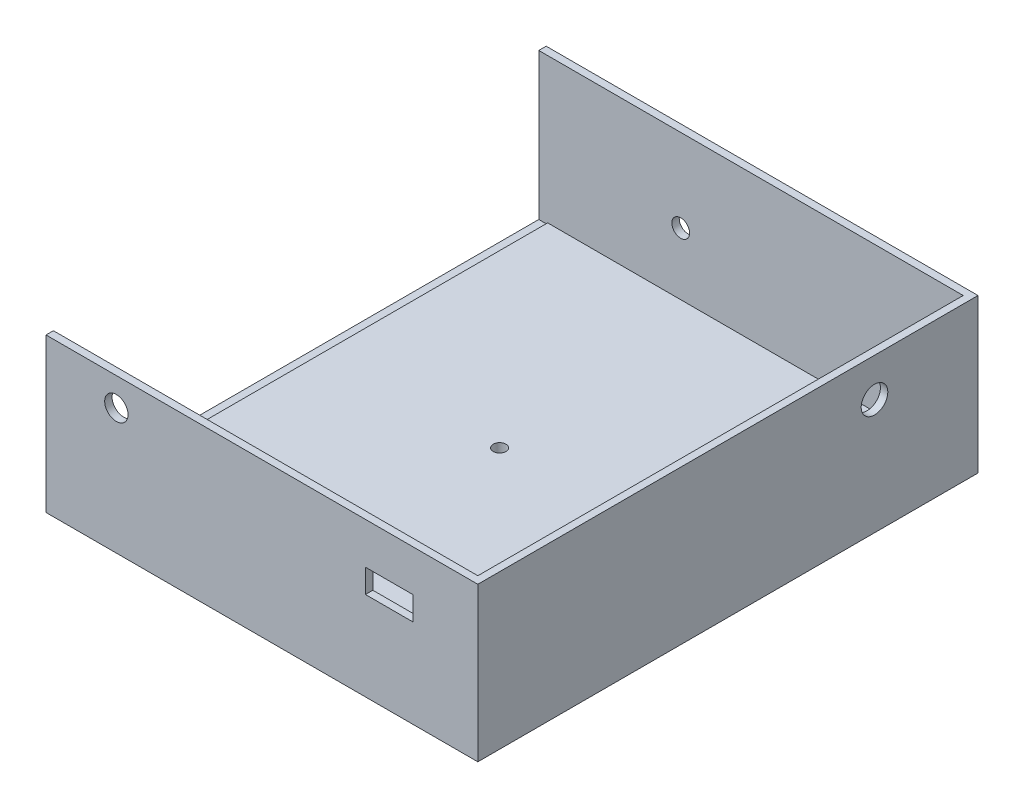
ISO-10303-21;
HEADER;
FILE_DESCRIPTION(('STEP AP214'),'2;1');
FILE_NAME('part.step','',(''),(''),'','','');
FILE_SCHEMA(('AUTOMOTIVE_DESIGN { 1 0 10303 214 1 1 1 1 }'));
ENDSEC;
DATA;
#1=APPLICATION_CONTEXT('core data for automotive mechanical design processes');
#2=APPLICATION_PROTOCOL_DEFINITION('international standard','automotive_design',2000,#1);
#3=PRODUCT_CONTEXT('',#1,'mechanical');
#4=PRODUCT('Part','Part','',(#3));
#5=PRODUCT_RELATED_PRODUCT_CATEGORY('part','',(#4));
#6=PRODUCT_DEFINITION_FORMATION('','',#4);
#7=PRODUCT_DEFINITION_CONTEXT('part definition',#1,'design');
#8=PRODUCT_DEFINITION('design','',#6,#7);
#9=PRODUCT_DEFINITION_SHAPE('','',#8);
#10=(LENGTH_UNIT() NAMED_UNIT(*) SI_UNIT(.MILLI.,.METRE.));
#11=(NAMED_UNIT(*) PLANE_ANGLE_UNIT() SI_UNIT($,.RADIAN.));
#12=(NAMED_UNIT(*) SI_UNIT($,.STERADIAN.) SOLID_ANGLE_UNIT());
#13=UNCERTAINTY_MEASURE_WITH_UNIT(LENGTH_MEASURE(1.E-05),#10,'distance_accuracy_value','');
#14=(GEOMETRIC_REPRESENTATION_CONTEXT(3) GLOBAL_UNCERTAINTY_ASSIGNED_CONTEXT((#13)) GLOBAL_UNIT_ASSIGNED_CONTEXT((#10,
#11,#12)) REPRESENTATION_CONTEXT('',''));
#15=CARTESIAN_POINT('',(0.,0.,0.));
#16=DIRECTION('',(0.,0.,1.));
#17=DIRECTION('',(1.,0.,0.));
#18=AXIS2_PLACEMENT_3D('',#15,#16,#17);
#19=CARTESIAN_POINT('',(0.,3.,0.));
#20=DIRECTION('',(0.,-1.,0.));
#21=DIRECTION('',(0.,0.,-1.));
#22=AXIS2_PLACEMENT_3D('',#19,#20,#21);
#23=PLANE('',#22);
#24=CARTESIAN_POINT('',(-29.370088028169,3.,-19.5179313380281));
#25=DIRECTION('',(0.,1.,0.));
#26=DIRECTION('',(0.,0.,1.));
#27=AXIS2_PLACEMENT_3D('',#24,#25,#26);
#28=CIRCLE('',#27,2.16);
#29=CARTESIAN_POINT('',(-29.370088028169,3.,-17.3579313380281));
#30=VERTEX_POINT('',#29);
#31=EDGE_CURVE('E198',#30,#30,#28,.T.);
#32=ORIENTED_EDGE('',*,*,#31,.F.);
#33=EDGE_LOOP('',(#32));
#34=FACE_BOUND('',#33,.T.);
#35=CARTESIAN_POINT('',(39.2399119718309,3.,-79.3579313380281));
#36=DIRECTION('',(0.,1.,0.));
#37=DIRECTION('',(0.,0.,1.));
#38=AXIS2_PLACEMENT_3D('',#35,#36,#37);
#39=CIRCLE('',#38,2.16);
#40=CARTESIAN_POINT('',(39.2399119718309,3.,-77.1979313380281));
#41=VERTEX_POINT('',#40);
#42=EDGE_CURVE('E205',#41,#41,#39,.T.);
#43=ORIENTED_EDGE('',*,*,#42,.F.);
#44=EDGE_LOOP('',(#43));
#45=FACE_BOUND('',#44,.T.);
#46=CARTESIAN_POINT('',(39.2399119718309,3.,56.4620686619718));
#47=DIRECTION('',(0.,1.,0.));
#48=DIRECTION('',(0.,0.,1.));
#49=AXIS2_PLACEMENT_3D('',#46,#47,#48);
#50=CIRCLE('',#49,2.16);
#51=CARTESIAN_POINT('',(39.2399119718309,3.,58.6220686619718));
#52=VERTEX_POINT('',#51);
#53=EDGE_CURVE('E201',#52,#52,#50,.T.);
#54=ORIENTED_EDGE('',*,*,#53,.F.);
#55=EDGE_LOOP('',(#54));
#56=FACE_BOUND('',#55,.T.);
#57=DIRECTION('',(0.,0.,-1.));
#58=VECTOR('',#57,1.);
#59=CARTESIAN_POINT('',(-87.130088028169,3.,0.));
#60=LINE('',#59,#58);
#61=CARTESIAN_POINT('',(-87.130088028169,3.,70.6220686619718));
#62=VERTEX_POINT('',#61);
#63=CARTESIAN_POINT('',(-87.130088028169,3.,-93.5179313380281));
#64=VERTEX_POINT('',#63);
#65=EDGE_CURVE('E11',#62,#64,#60,.T.);
#66=ORIENTED_EDGE('',*,*,#65,.F.);
#67=DIRECTION('',(1.,0.,0.));
#68=VECTOR('',#67,1.);
#69=CARTESIAN_POINT('',(-87.630088028169,3.,70.6220686619718));
#70=LINE('',#69,#68);
#71=CARTESIAN_POINT('',(53.399911971831,3.,70.6220686619718));
#72=VERTEX_POINT('',#71);
#73=EDGE_CURVE('E225',#62,#72,#70,.T.);
#74=ORIENTED_EDGE('',*,*,#73,.T.);
#75=DIRECTION('',(0.,0.,1.));
#76=VECTOR('',#75,1.);
#77=CARTESIAN_POINT('',(53.3999119718309,3.,-93.5179313380281));
#78=LINE('',#77,#76);
#79=CARTESIAN_POINT('',(53.3999119718309,3.,-93.5179313380281));
#80=VERTEX_POINT('',#79);
#81=EDGE_CURVE('E221',#80,#72,#78,.T.);
#82=ORIENTED_EDGE('',*,*,#81,.F.);
#83=DIRECTION('',(1.,0.,0.));
#84=VECTOR('',#83,1.);
#85=CARTESIAN_POINT('',(-87.630088028169,3.,-93.5179313380281));
#86=LINE('',#85,#84);
#87=EDGE_CURVE('E219',#64,#80,#86,.T.);
#88=ORIENTED_EDGE('',*,*,#87,.F.);
#89=EDGE_LOOP('',(#66,#74,#82,#88));
#90=FACE_BOUND('',#89,.T.);
#91=ADVANCED_FACE('F43',(#34,#45,#56,#90),#23,.F.);
#92=CARTESIAN_POINT('',(0.,52.,0.));
#93=DIRECTION('',(0.,-1.,0.));
#94=DIRECTION('',(0.,0.,-1.));
#95=AXIS2_PLACEMENT_3D('',#92,#93,#94);
#96=PLANE('',#95);
#97=DIRECTION('',(0.,0.,1.));
#98=VECTOR('',#97,1.);
#99=CARTESIAN_POINT('',(-90.130088028169,52.,-96.0179313380281));
#100=LINE('',#99,#98);
#101=CARTESIAN_POINT('',(-90.130088028169,52.,-96.0179313380281));
#102=VERTEX_POINT('',#101);
#103=CARTESIAN_POINT('',(-90.130088028169,52.,-93.5179313380281));
#104=VERTEX_POINT('',#103);
#105=EDGE_CURVE('E249',#102,#104,#100,.T.);
#106=ORIENTED_EDGE('',*,*,#105,.T.);
#107=DIRECTION('',(1.,0.,0.));
#108=VECTOR('',#107,1.);
#109=CARTESIAN_POINT('',(-87.630088028169,52.,-93.5179313380281));
#110=LINE('',#109,#108);
#111=CARTESIAN_POINT('',(53.3999119718309,52.,-93.5179313380281));
#112=VERTEX_POINT('',#111);
#113=EDGE_CURVE('E218',#104,#112,#110,.T.);
#114=ORIENTED_EDGE('',*,*,#113,.T.);
#115=DIRECTION('',(0.,0.,1.));
#116=VECTOR('',#115,1.);
#117=CARTESIAN_POINT('',(53.3999119718309,52.,-93.5179313380281));
#118=LINE('',#117,#116);
#119=CARTESIAN_POINT('',(53.399911971831,52.,70.6220686619718));
#120=VERTEX_POINT('',#119);
#121=EDGE_CURVE('E229',#112,#120,#118,.T.);
#122=ORIENTED_EDGE('',*,*,#121,.T.);
#123=DIRECTION('',(1.,0.,0.));
#124=VECTOR('',#123,1.);
#125=CARTESIAN_POINT('',(-87.630088028169,52.,70.6220686619718));
#126=LINE('',#125,#124);
#127=CARTESIAN_POINT('',(-90.130088028169,52.,70.6220686619718));
#128=VERTEX_POINT('',#127);
#129=EDGE_CURVE('E222',#128,#120,#126,.T.);
#130=ORIENTED_EDGE('',*,*,#129,.F.);
#131=CARTESIAN_POINT('',(-90.130088028169,52.,73.1220686619718));
#132=VERTEX_POINT('',#131);
#133=EDGE_CURVE('E248',#128,#132,#100,.T.);
#134=ORIENTED_EDGE('',*,*,#133,.T.);
#135=DIRECTION('',(1.,0.,0.));
#136=VECTOR('',#135,1.);
#137=CARTESIAN_POINT('',(-90.130088028169,52.,73.1220686619718));
#138=LINE('',#137,#136);
#139=CARTESIAN_POINT('',(55.899911971831,52.,73.1220686619718));
#140=VERTEX_POINT('',#139);
#141=EDGE_CURVE('E246',#132,#140,#138,.T.);
#142=ORIENTED_EDGE('',*,*,#141,.T.);
#143=DIRECTION('',(0.,0.,1.));
#144=VECTOR('',#143,1.);
#145=CARTESIAN_POINT('',(55.8999119718309,52.,-96.0179313380281));
#146=LINE('',#145,#144);
#147=CARTESIAN_POINT('',(55.8999119718309,52.,-96.0179313380281));
#148=VERTEX_POINT('',#147);
#149=EDGE_CURVE('E242',#148,#140,#146,.T.);
#150=ORIENTED_EDGE('',*,*,#149,.F.);
#151=DIRECTION('',(1.,0.,0.));
#152=VECTOR('',#151,1.);
#153=CARTESIAN_POINT('',(-90.130088028169,52.,-96.0179313380281));
#154=LINE('',#153,#152);
#155=EDGE_CURVE('E239',#102,#148,#154,.T.);
#156=ORIENTED_EDGE('',*,*,#155,.F.);
#157=EDGE_LOOP('',(#106,#114,#122,#130,#134,#142,#150,#156));
#158=FACE_BOUND('',#157,.T.);
#159=ADVANCED_FACE('F297',(#158),#96,.F.);
#160=CARTESIAN_POINT('',(-90.130088028169,52.,-96.0179313380281));
#161=DIRECTION('',(0.,0.,-1.));
#162=DIRECTION('',(-1.,0.,0.));
#163=AXIS2_PLACEMENT_3D('',#160,#161,#162);
#164=PLANE('',#163);
#165=CARTESIAN_POINT('',(-42.130088028169,24.,-96.0179313380281));
#166=DIRECTION('',(0.,0.,-1.));
#167=DIRECTION('',(-1.,0.,0.));
#168=AXIS2_PLACEMENT_3D('',#165,#166,#167);
#169=CIRCLE('',#168,3.);
#170=CARTESIAN_POINT('',(-45.130088028169,24.,-96.0179313380281));
#171=VERTEX_POINT('',#170);
#172=EDGE_CURVE('E287',#171,#171,#169,.T.);
#173=ORIENTED_EDGE('',*,*,#172,.F.);
#174=EDGE_LOOP('',(#173));
#175=FACE_BOUND('',#174,.T.);
#176=DIRECTION('',(1.,0.,0.));
#177=VECTOR('',#176,1.);
#178=CARTESIAN_POINT('',(-90.130088028169,0.,-96.0179313380281));
#179=LINE('',#178,#177);
#180=CARTESIAN_POINT('',(-90.130088028169,0.,-96.0179313380281));
#181=VERTEX_POINT('',#180);
#182=CARTESIAN_POINT('',(55.8999119718309,0.,-96.0179313380281));
#183=VERTEX_POINT('',#182);
#184=EDGE_CURVE('E238',#181,#183,#179,.T.);
#185=ORIENTED_EDGE('',*,*,#184,.F.);
#186=DIRECTION('',(0.,-1.,0.));
#187=VECTOR('',#186,1.);
#188=CARTESIAN_POINT('',(-90.130088028169,52.,-96.0179313380281));
#189=LINE('',#188,#187);
#190=EDGE_CURVE('E262',#102,#181,#189,.T.);
#191=ORIENTED_EDGE('',*,*,#190,.F.);
#192=ORIENTED_EDGE('',*,*,#155,.T.);
#193=DIRECTION('',(0.,-1.,0.));
#194=VECTOR('',#193,1.);
#195=CARTESIAN_POINT('',(55.8999119718309,52.,-96.0179313380281));
#196=LINE('',#195,#194);
#197=EDGE_CURVE('E252',#148,#183,#196,.T.);
#198=ORIENTED_EDGE('',*,*,#197,.T.);
#199=EDGE_LOOP('',(#185,#191,#192,#198));
#200=FACE_BOUND('',#199,.T.);
#201=ADVANCED_FACE('F45',(#175,#200),#164,.T.);
#202=CARTESIAN_POINT('',(-90.130088028169,52.,-96.0179313380281));
#203=DIRECTION('',(1.,0.,0.));
#204=DIRECTION('',(0.,0.,-1.));
#205=AXIS2_PLACEMENT_3D('',#202,#203,#204);
#206=PLANE('',#205);
#207=DIRECTION('',(0.,0.,1.));
#208=VECTOR('',#207,1.);
#209=CARTESIAN_POINT('',(-90.130088028169,2.5,-93.5179313380281));
#210=LINE('',#209,#208);
#211=CARTESIAN_POINT('',(-90.130088028169,2.5,-93.5179313380281));
#212=VERTEX_POINT('',#211);
#213=CARTESIAN_POINT('',(-90.130088028169,2.5,70.6220686619718));
#214=VERTEX_POINT('',#213);
#215=EDGE_CURVE('E170',#212,#214,#210,.T.);
#216=ORIENTED_EDGE('',*,*,#215,.F.);
#217=DIRECTION('',(0.,-1.,0.));
#218=VECTOR('',#217,1.);
#219=CARTESIAN_POINT('',(-90.130088028169,52.,-93.5179313380281));
#220=LINE('',#219,#218);
#221=EDGE_CURVE('E158',#104,#212,#220,.T.);
#222=ORIENTED_EDGE('',*,*,#221,.F.);
#223=ORIENTED_EDGE('',*,*,#105,.F.);
#224=ORIENTED_EDGE('',*,*,#190,.T.);
#225=DIRECTION('',(0.,0.,1.));
#226=VECTOR('',#225,1.);
#227=CARTESIAN_POINT('',(-90.130088028169,0.,-96.0179313380281));
#228=LINE('',#227,#226);
#229=CARTESIAN_POINT('',(-90.130088028169,0.,73.1220686619718));
#230=VERTEX_POINT('',#229);
#231=EDGE_CURVE('E243',#181,#230,#228,.T.);
#232=ORIENTED_EDGE('',*,*,#231,.T.);
#233=DIRECTION('',(0.,-1.,0.));
#234=VECTOR('',#233,1.);
#235=CARTESIAN_POINT('',(-90.130088028169,52.,73.1220686619718));
#236=LINE('',#235,#234);
#237=EDGE_CURVE('E265',#132,#230,#236,.T.);
#238=ORIENTED_EDGE('',*,*,#237,.F.);
#239=ORIENTED_EDGE('',*,*,#133,.F.);
#240=DIRECTION('',(0.,1.,0.));
#241=VECTOR('',#240,1.);
#242=CARTESIAN_POINT('',(-90.130088028169,52.,70.6220686619718));
#243=LINE('',#242,#241);
#244=EDGE_CURVE('E152',#214,#128,#243,.T.);
#245=ORIENTED_EDGE('',*,*,#244,.F.);
#246=EDGE_LOOP('',(#216,#222,#223,#224,#232,#238,#239,#245));
#247=FACE_BOUND('',#246,.T.);
#248=ADVANCED_FACE('F296',(#247),#206,.F.);
#249=CARTESIAN_POINT('',(-90.130088028169,52.,73.1220686619718));
#250=DIRECTION('',(0.,0.,-1.));
#251=DIRECTION('',(-1.,0.,0.));
#252=AXIS2_PLACEMENT_3D('',#249,#250,#251);
#253=PLANE('',#252);
#254=CARTESIAN_POINT('',(-66.3389109501777,42.5,73.1220686619718));
#255=DIRECTION('',(0.,0.,1.));
#256=DIRECTION('',(1.,0.,0.));
#257=AXIS2_PLACEMENT_3D('',#254,#255,#256);
#258=CIRCLE('',#257,3.95000000000001);
#259=CARTESIAN_POINT('',(-62.3889109501777,42.5,73.1220686619718));
#260=VERTEX_POINT('',#259);
#261=EDGE_CURVE('E280',#260,#260,#258,.T.);
#262=ORIENTED_EDGE('',*,*,#261,.F.);
#263=EDGE_LOOP('',(#262));
#264=FACE_BOUND('',#263,.T.);
#265=DIRECTION('',(0.,-1.,0.));
#266=VECTOR('',#265,1.);
#267=CARTESIAN_POINT('',(33.899911971831,38.,73.1220686619718));
#268=LINE('',#267,#266);
#269=CARTESIAN_POINT('',(33.899911971831,38.,73.1220686619718));
#270=VERTEX_POINT('',#269);
#271=CARTESIAN_POINT('',(33.899911971831,30.,73.1220686619718));
#272=VERTEX_POINT('',#271);
#273=EDGE_CURVE('E177',#270,#272,#268,.T.);
#274=ORIENTED_EDGE('',*,*,#273,.T.);
#275=DIRECTION('',(1.,0.,0.));
#276=VECTOR('',#275,1.);
#277=CARTESIAN_POINT('',(17.899911971831,30.,73.1220686619718));
#278=LINE('',#277,#276);
#279=CARTESIAN_POINT('',(17.899911971831,30.,73.1220686619718));
#280=VERTEX_POINT('',#279);
#281=EDGE_CURVE('E67',#280,#272,#278,.T.);
#282=ORIENTED_EDGE('',*,*,#281,.F.);
#283=DIRECTION('',(0.,-1.,0.));
#284=VECTOR('',#283,1.);
#285=CARTESIAN_POINT('',(17.899911971831,38.,73.1220686619718));
#286=LINE('',#285,#284);
#287=CARTESIAN_POINT('',(17.899911971831,38.,73.1220686619718));
#288=VERTEX_POINT('',#287);
#289=EDGE_CURVE('E183',#288,#280,#286,.T.);
#290=ORIENTED_EDGE('',*,*,#289,.F.);
#291=DIRECTION('',(1.,0.,0.));
#292=VECTOR('',#291,1.);
#293=CARTESIAN_POINT('',(17.899911971831,38.,73.1220686619718));
#294=LINE('',#293,#292);
#295=EDGE_CURVE('E180',#288,#270,#294,.T.);
#296=ORIENTED_EDGE('',*,*,#295,.T.);
#297=EDGE_LOOP('',(#274,#282,#290,#296));
#298=FACE_BOUND('',#297,.T.);
#299=DIRECTION('',(1.,0.,0.));
#300=VECTOR('',#299,1.);
#301=CARTESIAN_POINT('',(-90.130088028169,0.,73.1220686619718));
#302=LINE('',#301,#300);
#303=CARTESIAN_POINT('',(55.899911971831,0.,73.1220686619718));
#304=VERTEX_POINT('',#303);
#305=EDGE_CURVE('E258',#230,#304,#302,.T.);
#306=ORIENTED_EDGE('',*,*,#305,.T.);
#307=DIRECTION('',(0.,-1.,0.));
#308=VECTOR('',#307,1.);
#309=CARTESIAN_POINT('',(55.899911971831,52.,73.1220686619718));
#310=LINE('',#309,#308);
#311=EDGE_CURVE('E268',#140,#304,#310,.T.);
#312=ORIENTED_EDGE('',*,*,#311,.F.);
#313=ORIENTED_EDGE('',*,*,#141,.F.);
#314=ORIENTED_EDGE('',*,*,#237,.T.);
#315=EDGE_LOOP('',(#306,#312,#313,#314));
#316=FACE_BOUND('',#315,.T.);
#317=ADVANCED_FACE('F310',(#264,#298,#316),#253,.F.);
#318=CARTESIAN_POINT('',(55.8999119718309,52.,-96.0179313380281));
#319=DIRECTION('',(1.,0.,0.));
#320=DIRECTION('',(0.,0.,-1.));
#321=AXIS2_PLACEMENT_3D('',#318,#319,#320);
#322=PLANE('',#321);
#323=CARTESIAN_POINT('',(55.899911971831,39.,-61.0179313380281));
#324=DIRECTION('',(1.,0.,0.));
#325=DIRECTION('',(0.,0.,-1.));
#326=AXIS2_PLACEMENT_3D('',#323,#324,#325);
#327=CIRCLE('',#326,4.50000000000001);
#328=CARTESIAN_POINT('',(55.899911971831,39.,-65.5179313380281));
#329=VERTEX_POINT('',#328);
#330=EDGE_CURVE('E189',#329,#329,#327,.T.);
#331=ORIENTED_EDGE('',*,*,#330,.F.);
#332=EDGE_LOOP('',(#331));
#333=FACE_BOUND('',#332,.T.);
#334=DIRECTION('',(0.,0.,1.));
#335=VECTOR('',#334,1.);
#336=CARTESIAN_POINT('',(55.8999119718309,0.,-96.0179313380281));
#337=LINE('',#336,#335);
#338=EDGE_CURVE('E255',#183,#304,#337,.T.);
#339=ORIENTED_EDGE('',*,*,#338,.F.);
#340=ORIENTED_EDGE('',*,*,#197,.F.);
#341=ORIENTED_EDGE('',*,*,#149,.T.);
#342=ORIENTED_EDGE('',*,*,#311,.T.);
#343=EDGE_LOOP('',(#339,#340,#341,#342));
#344=FACE_BOUND('',#343,.T.);
#345=ADVANCED_FACE('F421',(#333,#344),#322,.T.);
#346=CARTESIAN_POINT('',(0.,0.,0.));
#347=DIRECTION('',(0.,-1.,0.));
#348=DIRECTION('',(0.,0.,-1.));
#349=AXIS2_PLACEMENT_3D('',#346,#347,#348);
#350=PLANE('',#349);
#351=CARTESIAN_POINT('',(39.2399119718309,0.,56.4620686619718));
#352=DIRECTION('',(0.,-1.,0.));
#353=DIRECTION('',(0.,0.,-1.));
#354=AXIS2_PLACEMENT_3D('',#351,#352,#353);
#355=CIRCLE('',#354,2.16);
#356=CARTESIAN_POINT('',(39.2399119718309,0.,54.3020686619718));
#357=VERTEX_POINT('',#356);
#358=EDGE_CURVE('E215',#357,#357,#355,.T.);
#359=ORIENTED_EDGE('',*,*,#358,.F.);
#360=EDGE_LOOP('',(#359));
#361=FACE_BOUND('',#360,.T.);
#362=CARTESIAN_POINT('',(39.2399119718309,0.,-79.3579313380281));
#363=DIRECTION('',(0.,-1.,0.));
#364=DIRECTION('',(0.,0.,-1.));
#365=AXIS2_PLACEMENT_3D('',#362,#363,#364);
#366=CIRCLE('',#365,2.16);
#367=CARTESIAN_POINT('',(39.2399119718309,0.,-81.5179313380281));
#368=VERTEX_POINT('',#367);
#369=EDGE_CURVE('E212',#368,#368,#366,.T.);
#370=ORIENTED_EDGE('',*,*,#369,.F.);
#371=EDGE_LOOP('',(#370));
#372=FACE_BOUND('',#371,.T.);
#373=CARTESIAN_POINT('',(-29.370088028169,0.,-19.5179313380281));
#374=DIRECTION('',(0.,-1.,0.));
#375=DIRECTION('',(0.,0.,-1.));
#376=AXIS2_PLACEMENT_3D('',#373,#374,#375);
#377=CIRCLE('',#376,2.16);
#378=CARTESIAN_POINT('',(-29.370088028169,0.,-21.6779313380282));
#379=VERTEX_POINT('',#378);
#380=EDGE_CURVE('E204',#379,#379,#377,.T.);
#381=ORIENTED_EDGE('',*,*,#380,.F.);
#382=EDGE_LOOP('',(#381));
#383=FACE_BOUND('',#382,.T.);
#384=ORIENTED_EDGE('',*,*,#184,.T.);
#385=ORIENTED_EDGE('',*,*,#338,.T.);
#386=ORIENTED_EDGE('',*,*,#305,.F.);
#387=ORIENTED_EDGE('',*,*,#231,.F.);
#388=EDGE_LOOP('',(#384,#385,#386,#387));
#389=FACE_BOUND('',#388,.T.);
#390=ADVANCED_FACE('F303',(#361,#372,#383,#389),#350,.T.);
#391=CARTESIAN_POINT('',(-87.630088028169,3.,-93.5179313380281));
#392=DIRECTION('',(0.,0.,1.));
#393=DIRECTION('',(1.,0.,0.));
#394=AXIS2_PLACEMENT_3D('',#391,#392,#393);
#395=PLANE('',#394);
#396=CARTESIAN_POINT('',(-42.130088028169,24.,-93.5179313380281));
#397=DIRECTION('',(0.,0.,1.));
#398=DIRECTION('',(1.,0.,0.));
#399=AXIS2_PLACEMENT_3D('',#396,#397,#398);
#400=CIRCLE('',#399,3.);
#401=CARTESIAN_POINT('',(-39.130088028169,24.,-93.5179313380281));
#402=VERTEX_POINT('',#401);
#403=EDGE_CURVE('E47',#402,#402,#400,.T.);
#404=ORIENTED_EDGE('',*,*,#403,.F.);
#405=EDGE_LOOP('',(#404));
#406=FACE_BOUND('',#405,.T.);
#407=ORIENTED_EDGE('',*,*,#113,.F.);
#408=ORIENTED_EDGE('',*,*,#221,.T.);
#409=DIRECTION('',(-1.,0.,0.));
#410=VECTOR('',#409,1.);
#411=CARTESIAN_POINT('',(-87.130088028169,2.5,-93.5179313380281));
#412=LINE('',#411,#410);
#413=CARTESIAN_POINT('',(-87.130088028169,2.5,-93.5179313380281));
#414=VERTEX_POINT('',#413);
#415=EDGE_CURVE('E155',#414,#212,#412,.T.);
#416=ORIENTED_EDGE('',*,*,#415,.F.);
#417=DIRECTION('',(0.,-1.,0.));
#418=VECTOR('',#417,1.);
#419=CARTESIAN_POINT('',(-87.130088028169,52.,-93.5179313380281));
#420=LINE('',#419,#418);
#421=EDGE_CURVE('E145',#64,#414,#420,.T.);
#422=ORIENTED_EDGE('',*,*,#421,.F.);
#423=ORIENTED_EDGE('',*,*,#87,.T.);
#424=DIRECTION('',(0.,1.,0.));
#425=VECTOR('',#424,1.);
#426=CARTESIAN_POINT('',(53.3999119718309,3.,-93.5179313380281));
#427=LINE('',#426,#425);
#428=EDGE_CURVE('E235',#80,#112,#427,.T.);
#429=ORIENTED_EDGE('',*,*,#428,.T.);
#430=EDGE_LOOP('',(#407,#408,#416,#422,#423,#429));
#431=FACE_BOUND('',#430,.T.);
#432=ADVANCED_FACE('F156',(#406,#431),#395,.T.);
#433=CARTESIAN_POINT('',(53.3999119718309,3.,-93.5179313380281));
#434=DIRECTION('',(-1.,0.,0.));
#435=DIRECTION('',(0.,0.,1.));
#436=AXIS2_PLACEMENT_3D('',#433,#434,#435);
#437=PLANE('',#436);
#438=CARTESIAN_POINT('',(53.399911971831,39.,-61.0179313380281));
#439=DIRECTION('',(1.,0.,0.));
#440=DIRECTION('',(0.,0.,-1.));
#441=AXIS2_PLACEMENT_3D('',#438,#439,#440);
#442=CIRCLE('',#441,4.50000000000001);
#443=CARTESIAN_POINT('',(53.399911971831,39.,-65.5179313380281));
#444=VERTEX_POINT('',#443);
#445=EDGE_CURVE('E195',#444,#444,#442,.T.);
#446=ORIENTED_EDGE('',*,*,#445,.T.);
#447=EDGE_LOOP('',(#446));
#448=FACE_BOUND('',#447,.T.);
#449=ORIENTED_EDGE('',*,*,#121,.F.);
#450=ORIENTED_EDGE('',*,*,#428,.F.);
#451=ORIENTED_EDGE('',*,*,#81,.T.);
#452=DIRECTION('',(0.,1.,0.));
#453=VECTOR('',#452,1.);
#454=CARTESIAN_POINT('',(53.399911971831,3.,70.6220686619718));
#455=LINE('',#454,#453);
#456=EDGE_CURVE('E227',#72,#120,#455,.T.);
#457=ORIENTED_EDGE('',*,*,#456,.T.);
#458=EDGE_LOOP('',(#449,#450,#451,#457));
#459=FACE_BOUND('',#458,.T.);
#460=ADVANCED_FACE('F326',(#448,#459),#437,.T.);
#461=CARTESIAN_POINT('',(-87.630088028169,3.,70.6220686619718));
#462=DIRECTION('',(0.,0.,1.));
#463=DIRECTION('',(1.,0.,0.));
#464=AXIS2_PLACEMENT_3D('',#461,#462,#463);
#465=PLANE('',#464);
#466=CARTESIAN_POINT('',(-66.3389109501777,42.5,70.6220686619718));
#467=DIRECTION('',(0.,0.,1.));
#468=DIRECTION('',(1.,0.,0.));
#469=AXIS2_PLACEMENT_3D('',#466,#467,#468);
#470=CIRCLE('',#469,3.95000000000001);
#471=CARTESIAN_POINT('',(-62.3889109501777,42.5,70.6220686619718));
#472=VERTEX_POINT('',#471);
#473=EDGE_CURVE('E171',#472,#472,#470,.T.);
#474=ORIENTED_EDGE('',*,*,#473,.T.);
#475=EDGE_LOOP('',(#474));
#476=FACE_BOUND('',#475,.T.);
#477=ORIENTED_EDGE('',*,*,#244,.T.);
#478=ORIENTED_EDGE('',*,*,#129,.T.);
#479=ORIENTED_EDGE('',*,*,#456,.F.);
#480=ORIENTED_EDGE('',*,*,#73,.F.);
#481=DIRECTION('',(0.,1.,0.));
#482=VECTOR('',#481,1.);
#483=CARTESIAN_POINT('',(-87.130088028169,52.,70.6220686619718));
#484=LINE('',#483,#482);
#485=CARTESIAN_POINT('',(-87.130088028169,2.5,70.6220686619718));
#486=VERTEX_POINT('',#485);
#487=EDGE_CURVE('E59',#486,#62,#484,.T.);
#488=ORIENTED_EDGE('',*,*,#487,.F.);
#489=DIRECTION('',(-1.,0.,0.));
#490=VECTOR('',#489,1.);
#491=CARTESIAN_POINT('',(-87.130088028169,2.5,70.6220686619718));
#492=LINE('',#491,#490);
#493=EDGE_CURVE('E162',#486,#214,#492,.T.);
#494=ORIENTED_EDGE('',*,*,#493,.T.);
#495=EDGE_LOOP('',(#477,#478,#479,#480,#488,#494));
#496=FACE_BOUND('',#495,.T.);
#497=DIRECTION('',(0.,-1.,0.));
#498=VECTOR('',#497,1.);
#499=CARTESIAN_POINT('',(17.899911971831,3.,70.6220686619718));
#500=LINE('',#499,#498);
#501=CARTESIAN_POINT('',(17.899911971831,38.,70.6220686619718));
#502=VERTEX_POINT('',#501);
#503=CARTESIAN_POINT('',(17.899911971831,30.,70.6220686619718));
#504=VERTEX_POINT('',#503);
#505=EDGE_CURVE('E275',#502,#504,#500,.T.);
#506=ORIENTED_EDGE('',*,*,#505,.T.);
#507=DIRECTION('',(1.,0.,0.));
#508=VECTOR('',#507,1.);
#509=CARTESIAN_POINT('',(-87.630088028169,30.,70.6220686619718));
#510=LINE('',#509,#508);
#511=CARTESIAN_POINT('',(33.899911971831,30.,70.6220686619718));
#512=VERTEX_POINT('',#511);
#513=EDGE_CURVE('E52',#504,#512,#510,.T.);
#514=ORIENTED_EDGE('',*,*,#513,.T.);
#515=DIRECTION('',(0.,-1.,0.));
#516=VECTOR('',#515,1.);
#517=CARTESIAN_POINT('',(33.899911971831,3.,70.6220686619718));
#518=LINE('',#517,#516);
#519=CARTESIAN_POINT('',(33.899911971831,38.,70.6220686619718));
#520=VERTEX_POINT('',#519);
#521=EDGE_CURVE('E264',#520,#512,#518,.T.);
#522=ORIENTED_EDGE('',*,*,#521,.F.);
#523=DIRECTION('',(1.,0.,0.));
#524=VECTOR('',#523,1.);
#525=CARTESIAN_POINT('',(-87.630088028169,38.,70.6220686619718));
#526=LINE('',#525,#524);
#527=EDGE_CURVE('E272',#502,#520,#526,.T.);
#528=ORIENTED_EDGE('',*,*,#527,.F.);
#529=EDGE_LOOP('',(#506,#514,#522,#528));
#530=FACE_BOUND('',#529,.T.);
#531=ADVANCED_FACE('F317',(#476,#496,#530),#465,.F.);
#532=CARTESIAN_POINT('',(-29.370088028169,-47.,-19.5179313380281));
#533=DIRECTION('',(0.,1.,0.));
#534=DIRECTION('',(0.,0.,1.));
#535=AXIS2_PLACEMENT_3D('',#532,#533,#534);
#536=CYLINDRICAL_SURFACE('',#535,2.16);
#537=ORIENTED_EDGE('',*,*,#380,.T.);
#538=EDGE_LOOP('',(#537));
#539=FACE_BOUND('',#538,.T.);
#540=ORIENTED_EDGE('',*,*,#31,.T.);
#541=EDGE_LOOP('',(#540));
#542=FACE_BOUND('',#541,.T.);
#543=ADVANCED_FACE('F335',(#539,#542),#536,.F.);
#544=CARTESIAN_POINT('',(39.2399119718309,-47.,-79.3579313380281));
#545=DIRECTION('',(0.,1.,0.));
#546=DIRECTION('',(0.,0.,1.));
#547=AXIS2_PLACEMENT_3D('',#544,#545,#546);
#548=CYLINDRICAL_SURFACE('',#547,2.16);
#549=ORIENTED_EDGE('',*,*,#369,.T.);
#550=EDGE_LOOP('',(#549));
#551=FACE_BOUND('',#550,.T.);
#552=ORIENTED_EDGE('',*,*,#42,.T.);
#553=EDGE_LOOP('',(#552));
#554=FACE_BOUND('',#553,.T.);
#555=ADVANCED_FACE('F353',(#551,#554),#548,.F.);
#556=CARTESIAN_POINT('',(39.2399119718309,-47.,56.4620686619718));
#557=DIRECTION('',(0.,1.,0.));
#558=DIRECTION('',(0.,0.,1.));
#559=AXIS2_PLACEMENT_3D('',#556,#557,#558);
#560=CYLINDRICAL_SURFACE('',#559,2.16);
#561=ORIENTED_EDGE('',*,*,#358,.T.);
#562=EDGE_LOOP('',(#561));
#563=FACE_BOUND('',#562,.T.);
#564=ORIENTED_EDGE('',*,*,#53,.T.);
#565=EDGE_LOOP('',(#564));
#566=FACE_BOUND('',#565,.T.);
#567=ADVANCED_FACE('F357',(#563,#566),#560,.F.);
#568=CARTESIAN_POINT('',(53.399911971831,39.,-61.0179313380281));
#569=DIRECTION('',(1.,0.,0.));
#570=DIRECTION('',(0.,0.,-1.));
#571=AXIS2_PLACEMENT_3D('',#568,#569,#570);
#572=CYLINDRICAL_SURFACE('',#571,4.50000000000001);
#573=ORIENTED_EDGE('',*,*,#445,.F.);
#574=EDGE_LOOP('',(#573));
#575=FACE_BOUND('',#574,.T.);
#576=ORIENTED_EDGE('',*,*,#330,.T.);
#577=EDGE_LOOP('',(#576));
#578=FACE_BOUND('',#577,.T.);
#579=ADVANCED_FACE('F361',(#575,#578),#572,.F.);
#580=CARTESIAN_POINT('',(17.899911971831,30.,70.1220686619718));
#581=DIRECTION('',(0.,-1.,0.));
#582=DIRECTION('',(0.,0.,-1.));
#583=AXIS2_PLACEMENT_3D('',#580,#581,#582);
#584=PLANE('',#583);
#585=DIRECTION('',(0.,0.,1.));
#586=VECTOR('',#585,1.);
#587=CARTESIAN_POINT('',(17.899911971831,30.,70.1220686619718));
#588=LINE('',#587,#586);
#589=EDGE_CURVE('E187',#504,#280,#588,.T.);
#590=ORIENTED_EDGE('',*,*,#589,.T.);
#591=ORIENTED_EDGE('',*,*,#281,.T.);
#592=DIRECTION('',(0.,0.,1.));
#593=VECTOR('',#592,1.);
#594=CARTESIAN_POINT('',(33.899911971831,30.,70.1220686619718));
#595=LINE('',#594,#593);
#596=EDGE_CURVE('E186',#512,#272,#595,.T.);
#597=ORIENTED_EDGE('',*,*,#596,.F.);
#598=ORIENTED_EDGE('',*,*,#513,.F.);
#599=EDGE_LOOP('',(#590,#591,#597,#598));
#600=FACE_BOUND('',#599,.T.);
#601=ADVANCED_FACE('F364',(#600),#584,.F.);
#602=CARTESIAN_POINT('',(17.899911971831,38.,70.1220686619718));
#603=DIRECTION('',(-1.,0.,0.));
#604=DIRECTION('',(0.,0.,1.));
#605=AXIS2_PLACEMENT_3D('',#602,#603,#604);
#606=PLANE('',#605);
#607=DIRECTION('',(0.,0.,1.));
#608=VECTOR('',#607,1.);
#609=CARTESIAN_POINT('',(17.899911971831,38.,70.1220686619718));
#610=LINE('',#609,#608);
#611=EDGE_CURVE('E190',#502,#288,#610,.T.);
#612=ORIENTED_EDGE('',*,*,#611,.T.);
#613=ORIENTED_EDGE('',*,*,#289,.T.);
#614=ORIENTED_EDGE('',*,*,#589,.F.);
#615=ORIENTED_EDGE('',*,*,#505,.F.);
#616=EDGE_LOOP('',(#612,#613,#614,#615));
#617=FACE_BOUND('',#616,.T.);
#618=ADVANCED_FACE('F368',(#617),#606,.F.);
#619=CARTESIAN_POINT('',(17.899911971831,38.,70.1220686619718));
#620=DIRECTION('',(0.,-1.,0.));
#621=DIRECTION('',(0.,0.,-1.));
#622=AXIS2_PLACEMENT_3D('',#619,#620,#621);
#623=PLANE('',#622);
#624=ORIENTED_EDGE('',*,*,#527,.T.);
#625=DIRECTION('',(0.,0.,1.));
#626=VECTOR('',#625,1.);
#627=CARTESIAN_POINT('',(33.899911971831,38.,70.1220686619718));
#628=LINE('',#627,#626);
#629=EDGE_CURVE('E192',#520,#270,#628,.T.);
#630=ORIENTED_EDGE('',*,*,#629,.T.);
#631=ORIENTED_EDGE('',*,*,#295,.F.);
#632=ORIENTED_EDGE('',*,*,#611,.F.);
#633=EDGE_LOOP('',(#624,#630,#631,#632));
#634=FACE_BOUND('',#633,.T.);
#635=ADVANCED_FACE('F371',(#634),#623,.T.);
#636=CARTESIAN_POINT('',(33.899911971831,38.,70.1220686619718));
#637=DIRECTION('',(-1.,0.,0.));
#638=DIRECTION('',(0.,0.,1.));
#639=AXIS2_PLACEMENT_3D('',#636,#637,#638);
#640=PLANE('',#639);
#641=ORIENTED_EDGE('',*,*,#521,.T.);
#642=ORIENTED_EDGE('',*,*,#596,.T.);
#643=ORIENTED_EDGE('',*,*,#273,.F.);
#644=ORIENTED_EDGE('',*,*,#629,.F.);
#645=EDGE_LOOP('',(#641,#642,#643,#644));
#646=FACE_BOUND('',#645,.T.);
#647=ADVANCED_FACE('F369',(#646),#640,.T.);
#648=CARTESIAN_POINT('',(-87.130088028169,0.,0.));
#649=DIRECTION('',(-1.,0.,0.));
#650=DIRECTION('',(0.,0.,1.));
#651=AXIS2_PLACEMENT_3D('',#648,#649,#650);
#652=PLANE('',#651);
#653=ORIENTED_EDGE('',*,*,#65,.T.);
#654=ORIENTED_EDGE('',*,*,#421,.T.);
#655=DIRECTION('',(0.,0.,1.));
#656=VECTOR('',#655,1.);
#657=CARTESIAN_POINT('',(-87.130088028169,2.5,-93.5179313380281));
#658=LINE('',#657,#656);
#659=EDGE_CURVE('E149',#414,#486,#658,.T.);
#660=ORIENTED_EDGE('',*,*,#659,.T.);
#661=ORIENTED_EDGE('',*,*,#487,.T.);
#662=EDGE_LOOP('',(#653,#654,#660,#661));
#663=FACE_BOUND('',#662,.T.);
#664=ADVANCED_FACE('F147',(#663),#652,.T.);
#665=CARTESIAN_POINT('',(-87.130088028169,2.5,-93.5179313380281));
#666=DIRECTION('',(0.,-1.,0.));
#667=DIRECTION('',(0.,0.,-1.));
#668=AXIS2_PLACEMENT_3D('',#665,#666,#667);
#669=PLANE('',#668);
#670=ORIENTED_EDGE('',*,*,#215,.T.);
#671=ORIENTED_EDGE('',*,*,#493,.F.);
#672=ORIENTED_EDGE('',*,*,#659,.F.);
#673=ORIENTED_EDGE('',*,*,#415,.T.);
#674=EDGE_LOOP('',(#670,#671,#672,#673));
#675=FACE_BOUND('',#674,.T.);
#676=ADVANCED_FACE('F164',(#675),#669,.F.);
#677=CARTESIAN_POINT('',(-66.3389109501777,42.5,70.1220686619718));
#678=DIRECTION('',(0.,0.,1.));
#679=DIRECTION('',(1.,0.,0.));
#680=AXIS2_PLACEMENT_3D('',#677,#678,#679);
#681=CYLINDRICAL_SURFACE('',#680,3.95000000000001);
#682=ORIENTED_EDGE('',*,*,#261,.T.);
#683=EDGE_LOOP('',(#682));
#684=FACE_BOUND('',#683,.T.);
#685=ORIENTED_EDGE('',*,*,#473,.F.);
#686=EDGE_LOOP('',(#685));
#687=FACE_BOUND('',#686,.T.);
#688=ADVANCED_FACE('F381',(#684,#687),#681,.F.);
#689=CARTESIAN_POINT('',(-42.130088028169,24.,-93.0179313380281));
#690=DIRECTION('',(0.,0.,-1.));
#691=DIRECTION('',(-1.,0.,0.));
#692=AXIS2_PLACEMENT_3D('',#689,#690,#691);
#693=CYLINDRICAL_SURFACE('',#692,3.);
#694=ORIENTED_EDGE('',*,*,#403,.T.);
#695=EDGE_LOOP('',(#694));
#696=FACE_BOUND('',#695,.T.);
#697=ORIENTED_EDGE('',*,*,#172,.T.);
#698=EDGE_LOOP('',(#697));
#699=FACE_BOUND('',#698,.T.);
#700=ADVANCED_FACE('F292',(#696,#699),#693,.F.);
#701=CLOSED_SHELL('',(#91,#159,#201,#248,#317,#345,#390,#432,#460,#531,#543,#555,#567,#579,#601,
#618,#635,#647,#664,#676,#688,#700));
#702=MANIFOLD_SOLID_BREP('B2',#701);
#703=ADVANCED_BREP_SHAPE_REPRESENTATION('',(#18,#702),#14);
#704=SHAPE_DEFINITION_REPRESENTATION(#9,#703);
ENDSEC;
END-ISO-10303-21;
